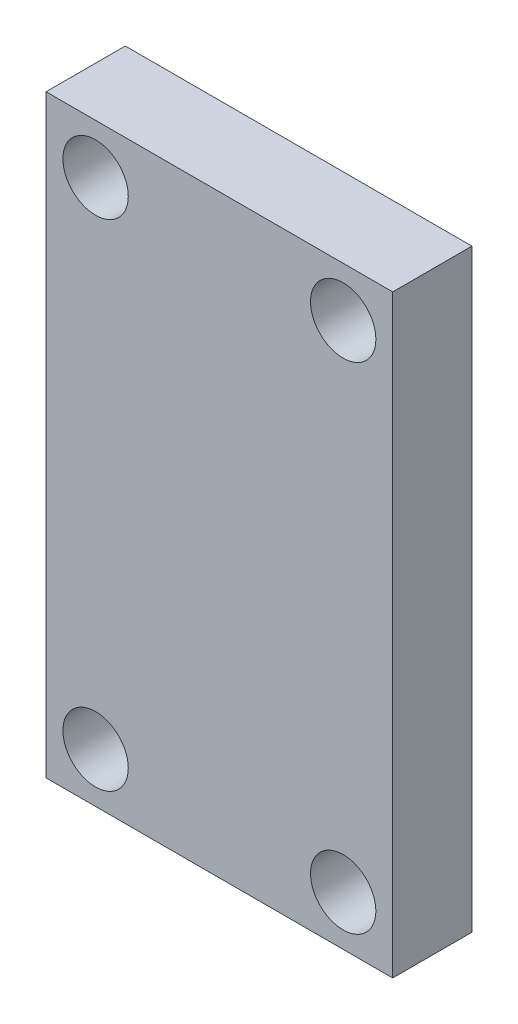
ISO-10303-21;
HEADER;
FILE_DESCRIPTION(('STEP AP214'),'2;1');
FILE_NAME('part.step','',(''),(''),'','','');
FILE_SCHEMA(('AUTOMOTIVE_DESIGN { 1 0 10303 214 1 1 1 1 }'));
ENDSEC;
DATA;
#1=APPLICATION_CONTEXT('core data for automotive mechanical design processes');
#2=APPLICATION_PROTOCOL_DEFINITION('international standard','automotive_design',2000,#1);
#3=PRODUCT_CONTEXT('',#1,'mechanical');
#4=PRODUCT('Part','Part','',(#3));
#5=PRODUCT_RELATED_PRODUCT_CATEGORY('part','',(#4));
#6=PRODUCT_DEFINITION_FORMATION('','',#4);
#7=PRODUCT_DEFINITION_CONTEXT('part definition',#1,'design');
#8=PRODUCT_DEFINITION('design','',#6,#7);
#9=PRODUCT_DEFINITION_SHAPE('','',#8);
#10=(LENGTH_UNIT() NAMED_UNIT(*) SI_UNIT(.MILLI.,.METRE.));
#11=(NAMED_UNIT(*) PLANE_ANGLE_UNIT() SI_UNIT($,.RADIAN.));
#12=(NAMED_UNIT(*) SI_UNIT($,.STERADIAN.) SOLID_ANGLE_UNIT());
#13=UNCERTAINTY_MEASURE_WITH_UNIT(LENGTH_MEASURE(1.E-05),#10,'distance_accuracy_value','');
#14=(GEOMETRIC_REPRESENTATION_CONTEXT(3) GLOBAL_UNCERTAINTY_ASSIGNED_CONTEXT((#13)) GLOBAL_UNIT_ASSIGNED_CONTEXT((#10,
#11,#12)) REPRESENTATION_CONTEXT('',''));
#15=CARTESIAN_POINT('',(0.,0.,0.));
#16=DIRECTION('',(0.,0.,1.));
#17=DIRECTION('',(1.,0.,0.));
#18=AXIS2_PLACEMENT_3D('',#15,#16,#17);
#19=CARTESIAN_POINT('',(17.5,30.,4.));
#20=DIRECTION('',(-1.,0.,0.));
#21=DIRECTION('',(0.,0.,1.));
#22=AXIS2_PLACEMENT_3D('',#19,#20,#21);
#23=PLANE('',#22);
#24=DIRECTION('',(0.,1.,0.));
#25=VECTOR('',#24,1.);
#26=CARTESIAN_POINT('',(17.5,30.,-4.));
#27=LINE('',#26,#25);
#28=CARTESIAN_POINT('',(17.5,-30.,-4.));
#29=VERTEX_POINT('',#28);
#30=CARTESIAN_POINT('',(17.5,30.,-4.));
#31=VERTEX_POINT('',#30);
#32=EDGE_CURVE('E106',#29,#31,#27,.T.);
#33=ORIENTED_EDGE('',*,*,#32,.T.);
#34=DIRECTION('',(0.,0.,-1.));
#35=VECTOR('',#34,1.);
#36=CARTESIAN_POINT('',(17.5,30.,4.));
#37=LINE('',#36,#35);
#38=CARTESIAN_POINT('',(17.5,30.,4.));
#39=VERTEX_POINT('',#38);
#40=EDGE_CURVE('E11',#39,#31,#37,.T.);
#41=ORIENTED_EDGE('',*,*,#40,.F.);
#42=DIRECTION('',(0.,1.,0.));
#43=VECTOR('',#42,1.);
#44=CARTESIAN_POINT('',(17.5,30.,4.));
#45=LINE('',#44,#43);
#46=CARTESIAN_POINT('',(17.5,-30.,4.));
#47=VERTEX_POINT('',#46);
#48=EDGE_CURVE('E94',#47,#39,#45,.T.);
#49=ORIENTED_EDGE('',*,*,#48,.F.);
#50=DIRECTION('',(0.,0.,-1.));
#51=VECTOR('',#50,1.);
#52=CARTESIAN_POINT('',(17.5,-30.,4.));
#53=LINE('',#52,#51);
#54=EDGE_CURVE('E102',#47,#29,#53,.T.);
#55=ORIENTED_EDGE('',*,*,#54,.T.);
#56=EDGE_LOOP('',(#33,#41,#49,#55));
#57=FACE_BOUND('',#56,.T.);
#58=ADVANCED_FACE('F43',(#57),#23,.F.);
#59=CARTESIAN_POINT('',(-17.5,30.,4.));
#60=DIRECTION('',(0.,-1.,0.));
#61=DIRECTION('',(0.,0.,-1.));
#62=AXIS2_PLACEMENT_3D('',#59,#60,#61);
#63=PLANE('',#62);
#64=DIRECTION('',(-1.,0.,0.));
#65=VECTOR('',#64,1.);
#66=CARTESIAN_POINT('',(-17.5,30.,-4.));
#67=LINE('',#66,#65);
#68=CARTESIAN_POINT('',(-17.5,30.,-4.));
#69=VERTEX_POINT('',#68);
#70=EDGE_CURVE('E98',#31,#69,#67,.T.);
#71=ORIENTED_EDGE('',*,*,#70,.T.);
#72=DIRECTION('',(0.,0.,-1.));
#73=VECTOR('',#72,1.);
#74=CARTESIAN_POINT('',(-17.5,30.,4.));
#75=LINE('',#74,#73);
#76=CARTESIAN_POINT('',(-17.5,30.,4.));
#77=VERTEX_POINT('',#76);
#78=EDGE_CURVE('E51',#77,#69,#75,.T.);
#79=ORIENTED_EDGE('',*,*,#78,.F.);
#80=DIRECTION('',(-1.,0.,0.));
#81=VECTOR('',#80,1.);
#82=CARTESIAN_POINT('',(-17.5,30.,4.));
#83=LINE('',#82,#81);
#84=EDGE_CURVE('E89',#39,#77,#83,.T.);
#85=ORIENTED_EDGE('',*,*,#84,.F.);
#86=ORIENTED_EDGE('',*,*,#40,.T.);
#87=EDGE_LOOP('',(#71,#79,#85,#86));
#88=FACE_BOUND('',#87,.T.);
#89=ADVANCED_FACE('F97',(#88),#63,.F.);
#90=CARTESIAN_POINT('',(-17.5,30.,4.));
#91=DIRECTION('',(1.,0.,0.));
#92=DIRECTION('',(0.,0.,-1.));
#93=AXIS2_PLACEMENT_3D('',#90,#91,#92);
#94=PLANE('',#93);
#95=DIRECTION('',(0.,-1.,0.));
#96=VECTOR('',#95,1.);
#97=CARTESIAN_POINT('',(-17.5,30.,-4.));
#98=LINE('',#97,#96);
#99=CARTESIAN_POINT('',(-17.5,-30.,-4.));
#100=VERTEX_POINT('',#99);
#101=EDGE_CURVE('E76',#69,#100,#98,.T.);
#102=ORIENTED_EDGE('',*,*,#101,.T.);
#103=DIRECTION('',(0.,0.,-1.));
#104=VECTOR('',#103,1.);
#105=CARTESIAN_POINT('',(-17.5,-30.,4.));
#106=LINE('',#105,#104);
#107=CARTESIAN_POINT('',(-17.5,-30.,4.));
#108=VERTEX_POINT('',#107);
#109=EDGE_CURVE('E99',#108,#100,#106,.T.);
#110=ORIENTED_EDGE('',*,*,#109,.F.);
#111=DIRECTION('',(0.,-1.,0.));
#112=VECTOR('',#111,1.);
#113=CARTESIAN_POINT('',(-17.5,30.,4.));
#114=LINE('',#113,#112);
#115=EDGE_CURVE('E92',#77,#108,#114,.T.);
#116=ORIENTED_EDGE('',*,*,#115,.F.);
#117=ORIENTED_EDGE('',*,*,#78,.T.);
#118=EDGE_LOOP('',(#102,#110,#116,#117));
#119=FACE_BOUND('',#118,.T.);
#120=ADVANCED_FACE('F100',(#119),#94,.F.);
#121=CARTESIAN_POINT('',(-17.5,-30.,4.));
#122=DIRECTION('',(0.,1.,0.));
#123=DIRECTION('',(0.,0.,1.));
#124=AXIS2_PLACEMENT_3D('',#121,#122,#123);
#125=PLANE('',#124);
#126=DIRECTION('',(1.,0.,0.));
#127=VECTOR('',#126,1.);
#128=CARTESIAN_POINT('',(-17.5,-30.,-4.));
#129=LINE('',#128,#127);
#130=EDGE_CURVE('E82',#100,#29,#129,.T.);
#131=ORIENTED_EDGE('',*,*,#130,.T.);
#132=ORIENTED_EDGE('',*,*,#54,.F.);
#133=DIRECTION('',(1.,0.,0.));
#134=VECTOR('',#133,1.);
#135=CARTESIAN_POINT('',(-17.5,-30.,4.));
#136=LINE('',#135,#134);
#137=EDGE_CURVE('E59',#108,#47,#136,.T.);
#138=ORIENTED_EDGE('',*,*,#137,.F.);
#139=ORIENTED_EDGE('',*,*,#109,.T.);
#140=EDGE_LOOP('',(#131,#132,#138,#139));
#141=FACE_BOUND('',#140,.T.);
#142=ADVANCED_FACE('F114',(#141),#125,.F.);
#143=CARTESIAN_POINT('',(0.,0.,4.));
#144=DIRECTION('',(0.,0.,1.));
#145=DIRECTION('',(1.,0.,0.));
#146=AXIS2_PLACEMENT_3D('',#143,#144,#145);
#147=PLANE('',#146);
#148=CARTESIAN_POINT('',(-12.5,-25.,4.));
#149=DIRECTION('',(0.,0.,1.));
#150=DIRECTION('',(1.,0.,0.));
#151=AXIS2_PLACEMENT_3D('',#148,#149,#150);
#152=CIRCLE('',#151,3.3);
#153=CARTESIAN_POINT('',(-9.2,-25.,4.));
#154=VERTEX_POINT('',#153);
#155=EDGE_CURVE('E140',#154,#154,#152,.T.);
#156=ORIENTED_EDGE('',*,*,#155,.F.);
#157=EDGE_LOOP('',(#156));
#158=FACE_BOUND('',#157,.T.);
#159=CARTESIAN_POINT('',(12.5,-25.,4.));
#160=DIRECTION('',(0.,0.,1.));
#161=DIRECTION('',(1.,0.,0.));
#162=AXIS2_PLACEMENT_3D('',#159,#160,#161);
#163=CIRCLE('',#162,3.3);
#164=CARTESIAN_POINT('',(15.8,-25.,4.));
#165=VERTEX_POINT('',#164);
#166=EDGE_CURVE('E134',#165,#165,#163,.T.);
#167=ORIENTED_EDGE('',*,*,#166,.F.);
#168=EDGE_LOOP('',(#167));
#169=FACE_BOUND('',#168,.T.);
#170=CARTESIAN_POINT('',(12.5,25.,4.));
#171=DIRECTION('',(0.,0.,1.));
#172=DIRECTION('',(1.,0.,0.));
#173=AXIS2_PLACEMENT_3D('',#170,#171,#172);
#174=CIRCLE('',#173,3.3);
#175=CARTESIAN_POINT('',(15.8,25.,4.));
#176=VERTEX_POINT('',#175);
#177=EDGE_CURVE('E128',#176,#176,#174,.T.);
#178=ORIENTED_EDGE('',*,*,#177,.F.);
#179=EDGE_LOOP('',(#178));
#180=FACE_BOUND('',#179,.T.);
#181=CARTESIAN_POINT('',(-12.5,25.,4.));
#182=DIRECTION('',(0.,0.,1.));
#183=DIRECTION('',(1.,0.,0.));
#184=AXIS2_PLACEMENT_3D('',#181,#182,#183);
#185=CIRCLE('',#184,3.3);
#186=CARTESIAN_POINT('',(-9.2,25.,4.));
#187=VERTEX_POINT('',#186);
#188=EDGE_CURVE('E122',#187,#187,#185,.T.);
#189=ORIENTED_EDGE('',*,*,#188,.F.);
#190=EDGE_LOOP('',(#189));
#191=FACE_BOUND('',#190,.T.);
#192=ORIENTED_EDGE('',*,*,#48,.T.);
#193=ORIENTED_EDGE('',*,*,#84,.T.);
#194=ORIENTED_EDGE('',*,*,#115,.T.);
#195=ORIENTED_EDGE('',*,*,#137,.T.);
#196=EDGE_LOOP('',(#192,#193,#194,#195));
#197=FACE_BOUND('',#196,.T.);
#198=ADVANCED_FACE('F90',(#158,#169,#180,#191,#197),#147,.T.);
#199=CARTESIAN_POINT('',(0.,0.,-4.));
#200=DIRECTION('',(0.,0.,1.));
#201=DIRECTION('',(1.,0.,0.));
#202=AXIS2_PLACEMENT_3D('',#199,#200,#201);
#203=PLANE('',#202);
#204=CARTESIAN_POINT('',(-12.5,-25.,-4.));
#205=DIRECTION('',(0.,0.,1.));
#206=DIRECTION('',(1.,0.,0.));
#207=AXIS2_PLACEMENT_3D('',#204,#205,#206);
#208=CIRCLE('',#207,3.3);
#209=CARTESIAN_POINT('',(-9.2,-25.,-4.));
#210=VERTEX_POINT('',#209);
#211=EDGE_CURVE('E137',#210,#210,#208,.T.);
#212=ORIENTED_EDGE('',*,*,#211,.T.);
#213=EDGE_LOOP('',(#212));
#214=FACE_BOUND('',#213,.T.);
#215=CARTESIAN_POINT('',(12.5,-25.,-4.));
#216=DIRECTION('',(0.,0.,1.));
#217=DIRECTION('',(1.,0.,0.));
#218=AXIS2_PLACEMENT_3D('',#215,#216,#217);
#219=CIRCLE('',#218,3.3);
#220=CARTESIAN_POINT('',(15.8,-25.,-4.));
#221=VERTEX_POINT('',#220);
#222=EDGE_CURVE('E131',#221,#221,#219,.T.);
#223=ORIENTED_EDGE('',*,*,#222,.T.);
#224=EDGE_LOOP('',(#223));
#225=FACE_BOUND('',#224,.T.);
#226=CARTESIAN_POINT('',(12.5,25.,-4.));
#227=DIRECTION('',(0.,0.,1.));
#228=DIRECTION('',(1.,0.,0.));
#229=AXIS2_PLACEMENT_3D('',#226,#227,#228);
#230=CIRCLE('',#229,3.3);
#231=CARTESIAN_POINT('',(15.8,25.,-4.));
#232=VERTEX_POINT('',#231);
#233=EDGE_CURVE('E125',#232,#232,#230,.T.);
#234=ORIENTED_EDGE('',*,*,#233,.T.);
#235=EDGE_LOOP('',(#234));
#236=FACE_BOUND('',#235,.T.);
#237=CARTESIAN_POINT('',(-12.5,25.,-4.));
#238=DIRECTION('',(0.,0.,1.));
#239=DIRECTION('',(1.,0.,0.));
#240=AXIS2_PLACEMENT_3D('',#237,#238,#239);
#241=CIRCLE('',#240,3.3);
#242=CARTESIAN_POINT('',(-9.2,25.,-4.));
#243=VERTEX_POINT('',#242);
#244=EDGE_CURVE('E109',#243,#243,#241,.T.);
#245=ORIENTED_EDGE('',*,*,#244,.T.);
#246=EDGE_LOOP('',(#245));
#247=FACE_BOUND('',#246,.T.);
#248=ORIENTED_EDGE('',*,*,#32,.F.);
#249=ORIENTED_EDGE('',*,*,#130,.F.);
#250=ORIENTED_EDGE('',*,*,#101,.F.);
#251=ORIENTED_EDGE('',*,*,#70,.F.);
#252=EDGE_LOOP('',(#248,#249,#250,#251));
#253=FACE_BOUND('',#252,.T.);
#254=ADVANCED_FACE('F117',(#214,#225,#236,#247,#253),#203,.F.);
#255=CARTESIAN_POINT('',(-12.5,25.,4.));
#256=DIRECTION('',(0.,0.,1.));
#257=DIRECTION('',(1.,0.,0.));
#258=AXIS2_PLACEMENT_3D('',#255,#256,#257);
#259=CYLINDRICAL_SURFACE('',#258,3.3);
#260=ORIENTED_EDGE('',*,*,#244,.F.);
#261=EDGE_LOOP('',(#260));
#262=FACE_BOUND('',#261,.T.);
#263=ORIENTED_EDGE('',*,*,#188,.T.);
#264=EDGE_LOOP('',(#263));
#265=FACE_BOUND('',#264,.T.);
#266=ADVANCED_FACE('F155',(#262,#265),#259,.F.);
#267=CARTESIAN_POINT('',(12.5,25.,4.));
#268=DIRECTION('',(0.,0.,1.));
#269=DIRECTION('',(1.,0.,0.));
#270=AXIS2_PLACEMENT_3D('',#267,#268,#269);
#271=CYLINDRICAL_SURFACE('',#270,3.3);
#272=ORIENTED_EDGE('',*,*,#233,.F.);
#273=EDGE_LOOP('',(#272));
#274=FACE_BOUND('',#273,.T.);
#275=ORIENTED_EDGE('',*,*,#177,.T.);
#276=EDGE_LOOP('',(#275));
#277=FACE_BOUND('',#276,.T.);
#278=ADVANCED_FACE('F157',(#274,#277),#271,.F.);
#279=CARTESIAN_POINT('',(12.5,-25.,4.));
#280=DIRECTION('',(0.,0.,1.));
#281=DIRECTION('',(1.,0.,0.));
#282=AXIS2_PLACEMENT_3D('',#279,#280,#281);
#283=CYLINDRICAL_SURFACE('',#282,3.3);
#284=ORIENTED_EDGE('',*,*,#222,.F.);
#285=EDGE_LOOP('',(#284));
#286=FACE_BOUND('',#285,.T.);
#287=ORIENTED_EDGE('',*,*,#166,.T.);
#288=EDGE_LOOP('',(#287));
#289=FACE_BOUND('',#288,.T.);
#290=ADVANCED_FACE('F164',(#286,#289),#283,.F.);
#291=CARTESIAN_POINT('',(-12.5,-25.,4.));
#292=DIRECTION('',(0.,0.,1.));
#293=DIRECTION('',(1.,0.,0.));
#294=AXIS2_PLACEMENT_3D('',#291,#292,#293);
#295=CYLINDRICAL_SURFACE('',#294,3.3);
#296=ORIENTED_EDGE('',*,*,#211,.F.);
#297=EDGE_LOOP('',(#296));
#298=FACE_BOUND('',#297,.T.);
#299=ORIENTED_EDGE('',*,*,#155,.T.);
#300=EDGE_LOOP('',(#299));
#301=FACE_BOUND('',#300,.T.);
#302=ADVANCED_FACE('F144',(#298,#301),#295,.F.);
#303=CLOSED_SHELL('',(#58,#89,#120,#142,#198,#254,#266,#278,#290,#302));
#304=MANIFOLD_SOLID_BREP('B2',#303);
#305=ADVANCED_BREP_SHAPE_REPRESENTATION('',(#18,#304),#14);
#306=SHAPE_DEFINITION_REPRESENTATION(#9,#305);
ENDSEC;
END-ISO-10303-21;
